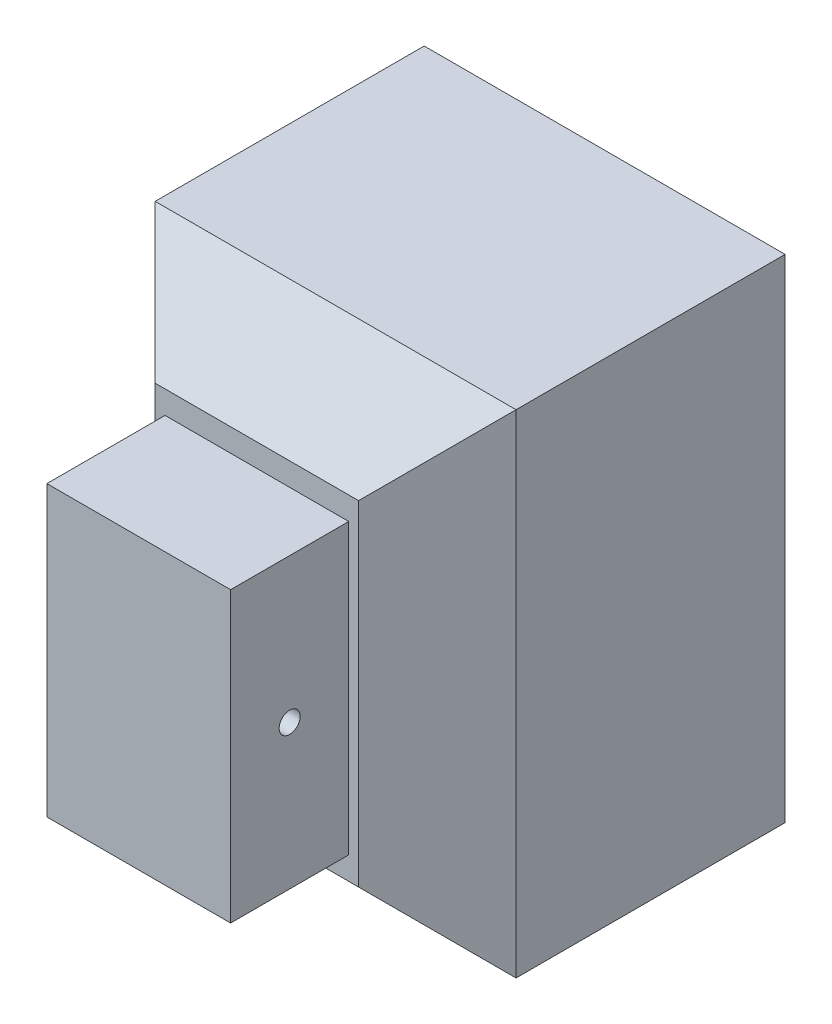
ISO-10303-21;
HEADER;
FILE_DESCRIPTION(('STEP AP214'),'2;1');
FILE_NAME('part.step','',(''),(''),'','','');
FILE_SCHEMA(('AUTOMOTIVE_DESIGN { 1 0 10303 214 1 1 1 1 }'));
ENDSEC;
DATA;
#1=APPLICATION_CONTEXT('core data for automotive mechanical design processes');
#2=APPLICATION_PROTOCOL_DEFINITION('international standard','automotive_design',2000,#1);
#3=PRODUCT_CONTEXT('',#1,'mechanical');
#4=PRODUCT('Part','Part','',(#3));
#5=PRODUCT_RELATED_PRODUCT_CATEGORY('part','',(#4));
#6=PRODUCT_DEFINITION_FORMATION('','',#4);
#7=PRODUCT_DEFINITION_CONTEXT('part definition',#1,'design');
#8=PRODUCT_DEFINITION('design','',#6,#7);
#9=PRODUCT_DEFINITION_SHAPE('','',#8);
#10=(LENGTH_UNIT() NAMED_UNIT(*) SI_UNIT(.MILLI.,.METRE.));
#11=(NAMED_UNIT(*) PLANE_ANGLE_UNIT() SI_UNIT($,.RADIAN.));
#12=(NAMED_UNIT(*) SI_UNIT($,.STERADIAN.) SOLID_ANGLE_UNIT());
#13=UNCERTAINTY_MEASURE_WITH_UNIT(LENGTH_MEASURE(1.E-05),#10,'distance_accuracy_value','');
#14=(GEOMETRIC_REPRESENTATION_CONTEXT(3) GLOBAL_UNCERTAINTY_ASSIGNED_CONTEXT((#13)) GLOBAL_UNIT_ASSIGNED_CONTEXT((#10,
#11,#12)) REPRESENTATION_CONTEXT('',''));
#15=CARTESIAN_POINT('',(0.,0.,0.));
#16=DIRECTION('',(0.,0.,1.));
#17=DIRECTION('',(1.,0.,0.));
#18=AXIS2_PLACEMENT_3D('',#15,#16,#17);
#19=CARTESIAN_POINT('',(55.,-32.1033210332103,29.2988929889299));
#20=DIRECTION('',(0.,0.,-1.));
#21=DIRECTION('',(-1.,0.,0.));
#22=AXIS2_PLACEMENT_3D('',#19,#20,#21);
#23=PLANE('',#22);
#24=DIRECTION('',(0.,-1.,0.));
#25=VECTOR('',#24,1.);
#26=CARTESIAN_POINT('',(12.0000000000001,-32.1033210332103,29.2988929889299));
#27=LINE('',#26,#25);
#28=CARTESIAN_POINT('',(12.0000000000001,30.8966789667896,29.2988929889299));
#29=VERTEX_POINT('',#28);
#30=CARTESIAN_POINT('',(12.0000000000001,-20.1033210332103,29.2988929889299));
#31=VERTEX_POINT('',#30);
#32=EDGE_CURVE('E189',#29,#31,#27,.T.);
#33=ORIENTED_EDGE('',*,*,#32,.T.);
#34=DIRECTION('',(1.,0.,0.));
#35=VECTOR('',#34,1.);
#36=CARTESIAN_POINT('',(55.,-20.1033210332103,29.2988929889299));
#37=LINE('',#36,#35);
#38=CARTESIAN_POINT('',(43.,-20.1033210332103,29.2988929889299));
#39=VERTEX_POINT('',#38);
#40=EDGE_CURVE('E191',#31,#39,#37,.T.);
#41=ORIENTED_EDGE('',*,*,#40,.T.);
#42=DIRECTION('',(0.,1.,0.));
#43=VECTOR('',#42,1.);
#44=CARTESIAN_POINT('',(43.,42.8966789667897,29.2988929889299));
#45=LINE('',#44,#43);
#46=CARTESIAN_POINT('',(43.,30.8966789667896,29.2988929889299));
#47=VERTEX_POINT('',#46);
#48=EDGE_CURVE('E185',#39,#47,#45,.T.);
#49=ORIENTED_EDGE('',*,*,#48,.T.);
#50=DIRECTION('',(-1.,0.,0.));
#51=VECTOR('',#50,1.);
#52=CARTESIAN_POINT('',(55.,30.8966789667896,29.2988929889299));
#53=LINE('',#52,#51);
#54=EDGE_CURVE('E187',#47,#29,#53,.T.);
#55=ORIENTED_EDGE('',*,*,#54,.T.);
#56=EDGE_LOOP('',(#33,#41,#49,#55));
#57=FACE_BOUND('',#56,.T.);
#58=DIRECTION('',(0.,-1.,0.));
#59=VECTOR('',#58,1.);
#60=CARTESIAN_POINT('',(13.5,27.3966789667897,29.2988929889299));
#61=LINE('',#60,#59);
#62=CARTESIAN_POINT('',(13.5,27.3966789667897,29.2988929889299));
#63=VERTEX_POINT('',#62);
#64=CARTESIAN_POINT('',(13.5,-16.6033210332103,29.2988929889299));
#65=VERTEX_POINT('',#64);
#66=EDGE_CURVE('E161',#63,#65,#61,.T.);
#67=ORIENTED_EDGE('',*,*,#66,.F.);
#68=DIRECTION('',(-1.,0.,0.));
#69=VECTOR('',#68,1.);
#70=CARTESIAN_POINT('',(13.5,27.3966789667897,29.2988929889299));
#71=LINE('',#70,#69);
#72=CARTESIAN_POINT('',(41.5,27.3966789667897,29.2988929889299));
#73=VERTEX_POINT('',#72);
#74=EDGE_CURVE('E158',#73,#63,#71,.T.);
#75=ORIENTED_EDGE('',*,*,#74,.F.);
#76=DIRECTION('',(0.,1.,0.));
#77=VECTOR('',#76,1.);
#78=CARTESIAN_POINT('',(41.5,27.3966789667897,29.2988929889299));
#79=LINE('',#78,#77);
#80=CARTESIAN_POINT('',(41.5,-16.6033210332103,29.2988929889299));
#81=VERTEX_POINT('',#80);
#82=EDGE_CURVE('E454',#81,#73,#79,.T.);
#83=ORIENTED_EDGE('',*,*,#82,.F.);
#84=DIRECTION('',(1.,0.,0.));
#85=VECTOR('',#84,1.);
#86=CARTESIAN_POINT('',(13.5,-16.6033210332103,29.2988929889299));
#87=LINE('',#86,#85);
#88=EDGE_CURVE('E452',#65,#81,#87,.T.);
#89=ORIENTED_EDGE('',*,*,#88,.F.);
#90=EDGE_LOOP('',(#67,#75,#83,#89));
#91=FACE_BOUND('',#90,.T.);
#92=ADVANCED_FACE('F45',(#57,#91),#23,.F.);
#93=CARTESIAN_POINT('',(55.,-32.1033210332103,29.2988929889299));
#94=DIRECTION('',(0.,1.,0.));
#95=DIRECTION('',(0.,0.,1.));
#96=AXIS2_PLACEMENT_3D('',#93,#94,#95);
#97=PLANE('',#96);
#98=DIRECTION('',(0.,0.,-1.));
#99=VECTOR('',#98,1.);
#100=CARTESIAN_POINT('',(55.,-32.1033210332103,29.2988929889299));
#101=LINE('',#100,#99);
#102=CARTESIAN_POINT('',(55.,-32.1033210332103,17.2988929889299));
#103=VERTEX_POINT('',#102);
#104=CARTESIAN_POINT('',(55.,-32.1033210332103,-23.7011070110701));
#105=VERTEX_POINT('',#104);
#106=EDGE_CURVE('E171',#103,#105,#101,.T.);
#107=ORIENTED_EDGE('',*,*,#106,.F.);
#108=DIRECTION('',(-1.,0.,0.));
#109=VECTOR('',#108,1.);
#110=CARTESIAN_POINT('',(55.,-32.1033210332103,17.2988929889299));
#111=LINE('',#110,#109);
#112=CARTESIAN_POINT('',(0.,-32.1033210332103,17.2988929889299));
#113=VERTEX_POINT('',#112);
#114=EDGE_CURVE('E182',#103,#113,#111,.T.);
#115=ORIENTED_EDGE('',*,*,#114,.T.);
#116=DIRECTION('',(0.,0.,-1.));
#117=VECTOR('',#116,1.);
#118=CARTESIAN_POINT('',(0.,-32.1033210332103,29.2988929889299));
#119=LINE('',#118,#117);
#120=CARTESIAN_POINT('',(0.,-32.1033210332103,-23.7011070110701));
#121=VERTEX_POINT('',#120);
#122=EDGE_CURVE('E162',#113,#121,#119,.T.);
#123=ORIENTED_EDGE('',*,*,#122,.T.);
#124=DIRECTION('',(1.,0.,0.));
#125=VECTOR('',#124,1.);
#126=CARTESIAN_POINT('',(55.,-32.1033210332103,-23.7011070110701));
#127=LINE('',#126,#125);
#128=EDGE_CURVE('E176',#121,#105,#127,.T.);
#129=ORIENTED_EDGE('',*,*,#128,.T.);
#130=EDGE_LOOP('',(#107,#115,#123,#129));
#131=FACE_BOUND('',#130,.T.);
#132=ADVANCED_FACE('F256',(#131),#97,.F.);
#133=CARTESIAN_POINT('',(55.,-32.1033210332103,-35.7011070110701));
#134=DIRECTION('',(0.,0.,1.));
#135=DIRECTION('',(1.,0.,0.));
#136=AXIS2_PLACEMENT_3D('',#133,#134,#135);
#137=PLANE('',#136);
#138=DIRECTION('',(0.,-1.,0.));
#139=VECTOR('',#138,1.);
#140=CARTESIAN_POINT('',(43.,-32.1033210332103,-35.7011070110701));
#141=LINE('',#140,#139);
#142=CARTESIAN_POINT('',(43.,30.8966789667896,-35.7011070110701));
#143=VERTEX_POINT('',#142);
#144=CARTESIAN_POINT('',(43.,-20.1033210332103,-35.7011070110701));
#145=VERTEX_POINT('',#144);
#146=EDGE_CURVE('E206',#143,#145,#141,.T.);
#147=ORIENTED_EDGE('',*,*,#146,.T.);
#148=DIRECTION('',(-1.,0.,0.));
#149=VECTOR('',#148,1.);
#150=CARTESIAN_POINT('',(55.,-20.1033210332103,-35.7011070110701));
#151=LINE('',#150,#149);
#152=CARTESIAN_POINT('',(12.0000000000001,-20.1033210332103,-35.7011070110701));
#153=VERTEX_POINT('',#152);
#154=EDGE_CURVE('E11',#145,#153,#151,.T.);
#155=ORIENTED_EDGE('',*,*,#154,.T.);
#156=DIRECTION('',(0.,1.,0.));
#157=VECTOR('',#156,1.);
#158=CARTESIAN_POINT('',(12.0000000000001,-32.1033210332103,-35.7011070110701));
#159=LINE('',#158,#157);
#160=CARTESIAN_POINT('',(12.0000000000001,30.8966789667896,-35.7011070110701));
#161=VERTEX_POINT('',#160);
#162=EDGE_CURVE('E55',#153,#161,#159,.T.);
#163=ORIENTED_EDGE('',*,*,#162,.T.);
#164=DIRECTION('',(1.,0.,0.));
#165=VECTOR('',#164,1.);
#166=CARTESIAN_POINT('',(55.,30.8966789667896,-35.7011070110701));
#167=LINE('',#166,#165);
#168=EDGE_CURVE('E208',#161,#143,#167,.T.);
#169=ORIENTED_EDGE('',*,*,#168,.T.);
#170=EDGE_LOOP('',(#147,#155,#163,#169));
#171=FACE_BOUND('',#170,.T.);
#172=ADVANCED_FACE('F288',(#171),#137,.F.);
#173=CARTESIAN_POINT('',(55.,42.8966789667897,29.2988929889299));
#174=DIRECTION('',(0.,-1.,0.));
#175=DIRECTION('',(0.,0.,-1.));
#176=AXIS2_PLACEMENT_3D('',#173,#174,#175);
#177=PLANE('',#176);
#178=DIRECTION('',(0.,0.,1.));
#179=VECTOR('',#178,1.);
#180=CARTESIAN_POINT('',(0.,42.8966789667897,29.2988929889299));
#181=LINE('',#180,#179);
#182=CARTESIAN_POINT('',(0.,42.8966789667897,-23.7011070110701));
#183=VERTEX_POINT('',#182);
#184=CARTESIAN_POINT('',(0.,42.8966789667897,17.2988929889299));
#185=VERTEX_POINT('',#184);
#186=EDGE_CURVE('E165',#183,#185,#181,.T.);
#187=ORIENTED_EDGE('',*,*,#186,.T.);
#188=DIRECTION('',(1.,0.,0.));
#189=VECTOR('',#188,1.);
#190=CARTESIAN_POINT('',(55.,42.8966789667897,17.2988929889299));
#191=LINE('',#190,#189);
#192=CARTESIAN_POINT('',(55.,42.8966789667897,17.2988929889299));
#193=VERTEX_POINT('',#192);
#194=EDGE_CURVE('E200',#185,#193,#191,.T.);
#195=ORIENTED_EDGE('',*,*,#194,.T.);
#196=DIRECTION('',(0.,0.,1.));
#197=VECTOR('',#196,1.);
#198=CARTESIAN_POINT('',(55.,42.8966789667897,29.2988929889299));
#199=LINE('',#198,#197);
#200=CARTESIAN_POINT('',(55.,42.8966789667897,-23.7011070110701));
#201=VERTEX_POINT('',#200);
#202=EDGE_CURVE('E174',#201,#193,#199,.T.);
#203=ORIENTED_EDGE('',*,*,#202,.F.);
#204=DIRECTION('',(-1.,0.,0.));
#205=VECTOR('',#204,1.);
#206=CARTESIAN_POINT('',(55.,42.8966789667897,-23.7011070110701));
#207=LINE('',#206,#205);
#208=EDGE_CURVE('E198',#201,#183,#207,.T.);
#209=ORIENTED_EDGE('',*,*,#208,.T.);
#210=EDGE_LOOP('',(#187,#195,#203,#209));
#211=FACE_BOUND('',#210,.T.);
#212=ADVANCED_FACE('F242',(#211),#177,.F.);
#213=CARTESIAN_POINT('',(55.,0.,0.));
#214=DIRECTION('',(1.,0.,0.));
#215=DIRECTION('',(0.,0.,-1.));
#216=AXIS2_PLACEMENT_3D('',#213,#214,#215);
#217=PLANE('',#216);
#218=ORIENTED_EDGE('',*,*,#202,.T.);
#219=DIRECTION('',(0.,-1.,0.));
#220=VECTOR('',#219,1.);
#221=CARTESIAN_POINT('',(55.,-32.1033210332103,17.2988929889299));
#222=LINE('',#221,#220);
#223=EDGE_CURVE('E204',#193,#103,#222,.T.);
#224=ORIENTED_EDGE('',*,*,#223,.T.);
#225=ORIENTED_EDGE('',*,*,#106,.T.);
#226=DIRECTION('',(0.,1.,0.));
#227=VECTOR('',#226,1.);
#228=CARTESIAN_POINT('',(55.,42.8966789667897,-23.7011070110701));
#229=LINE('',#228,#227);
#230=EDGE_CURVE('E202',#105,#201,#229,.T.);
#231=ORIENTED_EDGE('',*,*,#230,.T.);
#232=EDGE_LOOP('',(#218,#224,#225,#231));
#233=FACE_BOUND('',#232,.T.);
#234=ADVANCED_FACE('F270',(#233),#217,.T.);
#235=CARTESIAN_POINT('',(0.,0.,0.));
#236=DIRECTION('',(1.,0.,0.));
#237=DIRECTION('',(0.,0.,-1.));
#238=AXIS2_PLACEMENT_3D('',#235,#236,#237);
#239=PLANE('',#238);
#240=ORIENTED_EDGE('',*,*,#122,.F.);
#241=DIRECTION('',(0.,1.,0.));
#242=VECTOR('',#241,1.);
#243=CARTESIAN_POINT('',(0.,0.,17.2988929889299));
#244=LINE('',#243,#242);
#245=EDGE_CURVE('E196',#113,#185,#244,.T.);
#246=ORIENTED_EDGE('',*,*,#245,.T.);
#247=ORIENTED_EDGE('',*,*,#186,.F.);
#248=DIRECTION('',(0.,-1.,0.));
#249=VECTOR('',#248,1.);
#250=CARTESIAN_POINT('',(0.,0.,-23.7011070110701));
#251=LINE('',#250,#249);
#252=EDGE_CURVE('E194',#183,#121,#251,.T.);
#253=ORIENTED_EDGE('',*,*,#252,.T.);
#254=EDGE_LOOP('',(#240,#246,#247,#253));
#255=FACE_BOUND('',#254,.T.);
#256=ADVANCED_FACE('F246',(#255),#239,.F.);
#257=CARTESIAN_POINT('',(13.5,27.3966789667897,47.2988929889299));
#258=DIRECTION('',(1.,0.,0.));
#259=DIRECTION('',(0.,1.,0.));
#260=AXIS2_PLACEMENT_3D('',#257,#258,#259);
#261=PLANE('',#260);
#262=CARTESIAN_POINT('',(13.5,5.39667896678966,38.2988929889299));
#263=DIRECTION('',(1.,0.,0.));
#264=DIRECTION('',(0.,1.,0.));
#265=AXIS2_PLACEMENT_3D('',#262,#263,#264);
#266=CIRCLE('',#265,1.6);
#267=CARTESIAN_POINT('',(13.5,6.99667896678966,38.2988929889299));
#268=VERTEX_POINT('',#267);
#269=EDGE_CURVE('E224',#268,#268,#266,.T.);
#270=ORIENTED_EDGE('',*,*,#269,.T.);
#271=EDGE_LOOP('',(#270));
#272=FACE_BOUND('',#271,.T.);
#273=ORIENTED_EDGE('',*,*,#66,.T.);
#274=DIRECTION('',(0.,0.,-1.));
#275=VECTOR('',#274,1.);
#276=CARTESIAN_POINT('',(13.5,-16.6033210332103,47.2988929889299));
#277=LINE('',#276,#275);
#278=CARTESIAN_POINT('',(13.5,-16.6033210332103,47.2988929889299));
#279=VERTEX_POINT('',#278);
#280=EDGE_CURVE('E142',#279,#65,#277,.T.);
#281=ORIENTED_EDGE('',*,*,#280,.F.);
#282=DIRECTION('',(0.,-1.,0.));
#283=VECTOR('',#282,1.);
#284=CARTESIAN_POINT('',(13.5,27.3966789667897,47.2988929889299));
#285=LINE('',#284,#283);
#286=CARTESIAN_POINT('',(13.5,27.3966789667897,47.2988929889299));
#287=VERTEX_POINT('',#286);
#288=EDGE_CURVE('E149',#287,#279,#285,.T.);
#289=ORIENTED_EDGE('',*,*,#288,.F.);
#290=DIRECTION('',(0.,0.,-1.));
#291=VECTOR('',#290,1.);
#292=CARTESIAN_POINT('',(13.5,27.3966789667897,47.2988929889299));
#293=LINE('',#292,#291);
#294=EDGE_CURVE('E450',#287,#63,#293,.T.);
#295=ORIENTED_EDGE('',*,*,#294,.T.);
#296=EDGE_LOOP('',(#273,#281,#289,#295));
#297=FACE_BOUND('',#296,.T.);
#298=ADVANCED_FACE('F160',(#272,#297),#261,.F.);
#299=CARTESIAN_POINT('',(13.5,-16.6033210332103,47.2988929889299));
#300=DIRECTION('',(0.,1.,0.));
#301=DIRECTION('',(-1.,0.,0.));
#302=AXIS2_PLACEMENT_3D('',#299,#300,#301);
#303=PLANE('',#302);
#304=ORIENTED_EDGE('',*,*,#88,.T.);
#305=DIRECTION('',(0.,0.,-1.));
#306=VECTOR('',#305,1.);
#307=CARTESIAN_POINT('',(41.5,-16.6033210332103,47.2988929889299));
#308=LINE('',#307,#306);
#309=CARTESIAN_POINT('',(41.5,-16.6033210332103,47.2988929889299));
#310=VERTEX_POINT('',#309);
#311=EDGE_CURVE('E145',#310,#81,#308,.T.);
#312=ORIENTED_EDGE('',*,*,#311,.F.);
#313=DIRECTION('',(1.,0.,0.));
#314=VECTOR('',#313,1.);
#315=CARTESIAN_POINT('',(13.5,-16.6033210332103,47.2988929889299));
#316=LINE('',#315,#314);
#317=EDGE_CURVE('E137',#279,#310,#316,.T.);
#318=ORIENTED_EDGE('',*,*,#317,.F.);
#319=ORIENTED_EDGE('',*,*,#280,.T.);
#320=EDGE_LOOP('',(#304,#312,#318,#319));
#321=FACE_BOUND('',#320,.T.);
#322=ADVANCED_FACE('F140',(#321),#303,.F.);
#323=CARTESIAN_POINT('',(41.5,27.3966789667897,47.2988929889299));
#324=DIRECTION('',(-1.,0.,0.));
#325=DIRECTION('',(0.,0.,1.));
#326=AXIS2_PLACEMENT_3D('',#323,#324,#325);
#327=PLANE('',#326);
#328=CARTESIAN_POINT('',(41.5,5.39667896678966,38.2988929889299));
#329=DIRECTION('',(-1.,0.,0.));
#330=DIRECTION('',(0.,0.,1.));
#331=AXIS2_PLACEMENT_3D('',#328,#329,#330);
#332=CIRCLE('',#331,1.6);
#333=CARTESIAN_POINT('',(41.5,5.39667896678966,39.8988929889299));
#334=VERTEX_POINT('',#333);
#335=EDGE_CURVE('E50',#334,#334,#332,.T.);
#336=ORIENTED_EDGE('',*,*,#335,.T.);
#337=EDGE_LOOP('',(#336));
#338=FACE_BOUND('',#337,.T.);
#339=ORIENTED_EDGE('',*,*,#82,.T.);
#340=DIRECTION('',(0.,0.,-1.));
#341=VECTOR('',#340,1.);
#342=CARTESIAN_POINT('',(41.5,27.3966789667897,47.2988929889299));
#343=LINE('',#342,#341);
#344=CARTESIAN_POINT('',(41.5,27.3966789667897,47.2988929889299));
#345=VERTEX_POINT('',#344);
#346=EDGE_CURVE('E167',#345,#73,#343,.T.);
#347=ORIENTED_EDGE('',*,*,#346,.F.);
#348=DIRECTION('',(0.,1.,0.));
#349=VECTOR('',#348,1.);
#350=CARTESIAN_POINT('',(41.5,27.3966789667897,47.2988929889299));
#351=LINE('',#350,#349);
#352=EDGE_CURVE('E148',#310,#345,#351,.T.);
#353=ORIENTED_EDGE('',*,*,#352,.F.);
#354=ORIENTED_EDGE('',*,*,#311,.T.);
#355=EDGE_LOOP('',(#339,#347,#353,#354));
#356=FACE_BOUND('',#355,.T.);
#357=ADVANCED_FACE('F371',(#338,#356),#327,.F.);
#358=CARTESIAN_POINT('',(13.5,27.3966789667897,47.2988929889299));
#359=DIRECTION('',(0.,-1.,0.));
#360=DIRECTION('',(1.,0.,0.));
#361=AXIS2_PLACEMENT_3D('',#358,#359,#360);
#362=PLANE('',#361);
#363=ORIENTED_EDGE('',*,*,#74,.T.);
#364=ORIENTED_EDGE('',*,*,#294,.F.);
#365=DIRECTION('',(-1.,0.,0.));
#366=VECTOR('',#365,1.);
#367=CARTESIAN_POINT('',(13.5,27.3966789667897,47.2988929889299));
#368=LINE('',#367,#366);
#369=EDGE_CURVE('E154',#345,#287,#368,.T.);
#370=ORIENTED_EDGE('',*,*,#369,.F.);
#371=ORIENTED_EDGE('',*,*,#346,.T.);
#372=EDGE_LOOP('',(#363,#364,#370,#371));
#373=FACE_BOUND('',#372,.T.);
#374=ADVANCED_FACE('F362',(#373),#362,.F.);
#375=CARTESIAN_POINT('',(0.,0.,47.2988929889299));
#376=DIRECTION('',(0.,0.,1.));
#377=DIRECTION('',(1.,0.,0.));
#378=AXIS2_PLACEMENT_3D('',#375,#376,#377);
#379=PLANE('',#378);
#380=ORIENTED_EDGE('',*,*,#288,.T.);
#381=ORIENTED_EDGE('',*,*,#317,.T.);
#382=ORIENTED_EDGE('',*,*,#352,.T.);
#383=ORIENTED_EDGE('',*,*,#369,.T.);
#384=EDGE_LOOP('',(#380,#381,#382,#383));
#385=FACE_BOUND('',#384,.T.);
#386=ADVANCED_FACE('F152',(#385),#379,.T.);
#387=CARTESIAN_POINT('',(55.,30.8966789667896,29.2988929889299));
#388=DIRECTION('',(0.,-0.707106781186546,-0.707106781186549));
#389=DIRECTION('',(-1.,0.,0.));
#390=AXIS2_PLACEMENT_3D('',#387,#388,#389);
#391=PLANE('',#390);
#392=DIRECTION('',(0.577350269189626,-0.577350269189627,0.577350269189625));
#393=VECTOR('',#392,1.);
#394=CARTESIAN_POINT('',(26.3333333333334,16.5633456334563,43.6322263222632));
#395=LINE('',#394,#393);
#396=EDGE_CURVE('E216',#29,#185,#395,.F.);
#397=ORIENTED_EDGE('',*,*,#396,.F.);
#398=ORIENTED_EDGE('',*,*,#54,.F.);
#399=DIRECTION('',(0.577350269189626,0.577350269189627,-0.577350269189624));
#400=VECTOR('',#399,1.);
#401=CARTESIAN_POINT('',(40.7011070110701,28.5977859778597,31.5977859778597));
#402=LINE('',#401,#400);
#403=EDGE_CURVE('E219',#193,#47,#402,.F.);
#404=ORIENTED_EDGE('',*,*,#403,.F.);
#405=ORIENTED_EDGE('',*,*,#194,.F.);
#406=EDGE_LOOP('',(#397,#398,#404,#405));
#407=FACE_BOUND('',#406,.T.);
#408=ADVANCED_FACE('F267',(#407),#391,.F.);
#409=CARTESIAN_POINT('',(55.,0.,17.2988929889299));
#410=DIRECTION('',(0.707106781186546,0.,0.707106781186549));
#411=DIRECTION('',(0.,1.,0.));
#412=AXIS2_PLACEMENT_3D('',#409,#410,#411);
#413=PLANE('',#412);
#414=ORIENTED_EDGE('',*,*,#403,.T.);
#415=ORIENTED_EDGE('',*,*,#48,.F.);
#416=DIRECTION('',(-0.577350269189627,0.577350269189627,0.577350269189625));
#417=VECTOR('',#416,1.);
#418=CARTESIAN_POINT('',(44.2988929889299,-21.4022140221402,28.));
#419=LINE('',#418,#417);
#420=EDGE_CURVE('E213',#103,#39,#419,.T.);
#421=ORIENTED_EDGE('',*,*,#420,.F.);
#422=ORIENTED_EDGE('',*,*,#223,.F.);
#423=EDGE_LOOP('',(#414,#415,#421,#422));
#424=FACE_BOUND('',#423,.T.);
#425=ADVANCED_FACE('F272',(#424),#413,.T.);
#426=CARTESIAN_POINT('',(12.0000000000001,-32.1033210332103,29.2988929889299));
#427=DIRECTION('',(0.707106781186546,0.,-0.707106781186549));
#428=DIRECTION('',(0.,-1.,0.));
#429=AXIS2_PLACEMENT_3D('',#426,#427,#428);
#430=PLANE('',#429);
#431=ORIENTED_EDGE('',*,*,#396,.T.);
#432=ORIENTED_EDGE('',*,*,#245,.F.);
#433=DIRECTION('',(0.577350269189627,0.577350269189627,0.577350269189625));
#434=VECTOR('',#433,1.);
#435=CARTESIAN_POINT('',(8.00000000000002,-24.1033210332103,25.2988929889299));
#436=LINE('',#435,#434);
#437=EDGE_CURVE('E211',#31,#113,#436,.F.);
#438=ORIENTED_EDGE('',*,*,#437,.F.);
#439=ORIENTED_EDGE('',*,*,#32,.F.);
#440=EDGE_LOOP('',(#431,#432,#438,#439));
#441=FACE_BOUND('',#440,.T.);
#442=ADVANCED_FACE('F250',(#441),#430,.F.);
#443=CARTESIAN_POINT('',(55.,-32.1033210332103,17.2988929889299));
#444=DIRECTION('',(0.,0.707106781186546,-0.707106781186549));
#445=DIRECTION('',(-1.,0.,0.));
#446=AXIS2_PLACEMENT_3D('',#443,#444,#445);
#447=PLANE('',#446);
#448=ORIENTED_EDGE('',*,*,#420,.T.);
#449=ORIENTED_EDGE('',*,*,#40,.F.);
#450=ORIENTED_EDGE('',*,*,#437,.T.);
#451=ORIENTED_EDGE('',*,*,#114,.F.);
#452=EDGE_LOOP('',(#448,#449,#450,#451));
#453=FACE_BOUND('',#452,.T.);
#454=ADVANCED_FACE('F259',(#453),#447,.F.);
#455=CARTESIAN_POINT('',(55.,42.8966789667897,-23.7011070110701));
#456=DIRECTION('',(0.,-0.707106781186546,0.707106781186549));
#457=DIRECTION('',(-1.,0.,0.));
#458=AXIS2_PLACEMENT_3D('',#455,#456,#457);
#459=PLANE('',#458);
#460=DIRECTION('',(-0.577350269189626,0.577350269189626,0.577350269189624));
#461=VECTOR('',#460,1.);
#462=CARTESIAN_POINT('',(18.3333333333334,24.5633456334563,-42.0344403444034));
#463=LINE('',#462,#461);
#464=EDGE_CURVE('E226',#183,#161,#463,.F.);
#465=ORIENTED_EDGE('',*,*,#464,.F.);
#466=ORIENTED_EDGE('',*,*,#208,.F.);
#467=DIRECTION('',(-0.577350269189626,-0.577350269189626,-0.577350269189624));
#468=VECTOR('',#467,1.);
#469=CARTESIAN_POINT('',(40.7011070110701,28.5977859778597,-38.));
#470=LINE('',#469,#468);
#471=EDGE_CURVE('E214',#143,#201,#470,.F.);
#472=ORIENTED_EDGE('',*,*,#471,.F.);
#473=ORIENTED_EDGE('',*,*,#168,.F.);
#474=EDGE_LOOP('',(#465,#466,#472,#473));
#475=FACE_BOUND('',#474,.T.);
#476=ADVANCED_FACE('F48',(#475),#459,.F.);
#477=CARTESIAN_POINT('',(55.,0.,-23.7011070110701));
#478=DIRECTION('',(0.707106781186546,0.,-0.707106781186549));
#479=DIRECTION('',(0.,-1.,0.));
#480=AXIS2_PLACEMENT_3D('',#477,#478,#479);
#481=PLANE('',#480);
#482=ORIENTED_EDGE('',*,*,#471,.T.);
#483=ORIENTED_EDGE('',*,*,#230,.F.);
#484=DIRECTION('',(0.577350269189627,-0.577350269189626,0.577350269189625));
#485=VECTOR('',#484,1.);
#486=CARTESIAN_POINT('',(44.2988929889299,-21.4022140221402,-34.4022140221402));
#487=LINE('',#486,#485);
#488=EDGE_CURVE('E223',#145,#105,#487,.T.);
#489=ORIENTED_EDGE('',*,*,#488,.F.);
#490=ORIENTED_EDGE('',*,*,#146,.F.);
#491=EDGE_LOOP('',(#482,#483,#489,#490));
#492=FACE_BOUND('',#491,.T.);
#493=ADVANCED_FACE('F233',(#492),#481,.T.);
#494=CARTESIAN_POINT('',(12.0000000000001,-32.1033210332103,-35.7011070110701));
#495=DIRECTION('',(0.707106781186546,0.,0.707106781186549));
#496=DIRECTION('',(0.,1.,0.));
#497=AXIS2_PLACEMENT_3D('',#494,#495,#496);
#498=PLANE('',#497);
#499=ORIENTED_EDGE('',*,*,#464,.T.);
#500=ORIENTED_EDGE('',*,*,#162,.F.);
#501=DIRECTION('',(-0.577350269189627,-0.577350269189626,0.577350269189625));
#502=VECTOR('',#501,1.);
#503=CARTESIAN_POINT('',(8.00000000000003,-24.1033210332103,-31.7011070110701));
#504=LINE('',#503,#502);
#505=EDGE_CURVE('E63',#121,#153,#504,.F.);
#506=ORIENTED_EDGE('',*,*,#505,.F.);
#507=ORIENTED_EDGE('',*,*,#252,.F.);
#508=EDGE_LOOP('',(#499,#500,#506,#507));
#509=FACE_BOUND('',#508,.T.);
#510=ADVANCED_FACE('F318',(#509),#498,.F.);
#511=CARTESIAN_POINT('',(55.,-20.1033210332103,-35.7011070110701));
#512=DIRECTION('',(0.,0.707106781186546,0.707106781186549));
#513=DIRECTION('',(-1.,0.,0.));
#514=AXIS2_PLACEMENT_3D('',#511,#512,#513);
#515=PLANE('',#514);
#516=ORIENTED_EDGE('',*,*,#488,.T.);
#517=ORIENTED_EDGE('',*,*,#128,.F.);
#518=ORIENTED_EDGE('',*,*,#505,.T.);
#519=ORIENTED_EDGE('',*,*,#154,.F.);
#520=EDGE_LOOP('',(#516,#517,#518,#519));
#521=FACE_BOUND('',#520,.T.);
#522=ADVANCED_FACE('F311',(#521),#515,.F.);
#523=CARTESIAN_POINT('',(0.,5.39667896678966,38.2988929889299));
#524=DIRECTION('',(1.,0.,0.));
#525=DIRECTION('',(0.,0.,-1.));
#526=AXIS2_PLACEMENT_3D('',#523,#524,#525);
#527=CYLINDRICAL_SURFACE('',#526,1.6);
#528=ORIENTED_EDGE('',*,*,#335,.F.);
#529=EDGE_LOOP('',(#528));
#530=FACE_BOUND('',#529,.T.);
#531=ORIENTED_EDGE('',*,*,#269,.F.);
#532=EDGE_LOOP('',(#531));
#533=FACE_BOUND('',#532,.T.);
#534=ADVANCED_FACE('F317',(#530,#533),#527,.F.);
#535=CLOSED_SHELL('',(#92,#132,#172,#212,#234,#256,#298,#322,#357,#374,#386,#408,#425,#442,#454,
#476,#493,#510,#522,#534));
#536=MANIFOLD_SOLID_BREP('B2',#535);
#537=ADVANCED_BREP_SHAPE_REPRESENTATION('',(#18,#536),#14);
#538=SHAPE_DEFINITION_REPRESENTATION(#9,#537);
ENDSEC;
END-ISO-10303-21;
